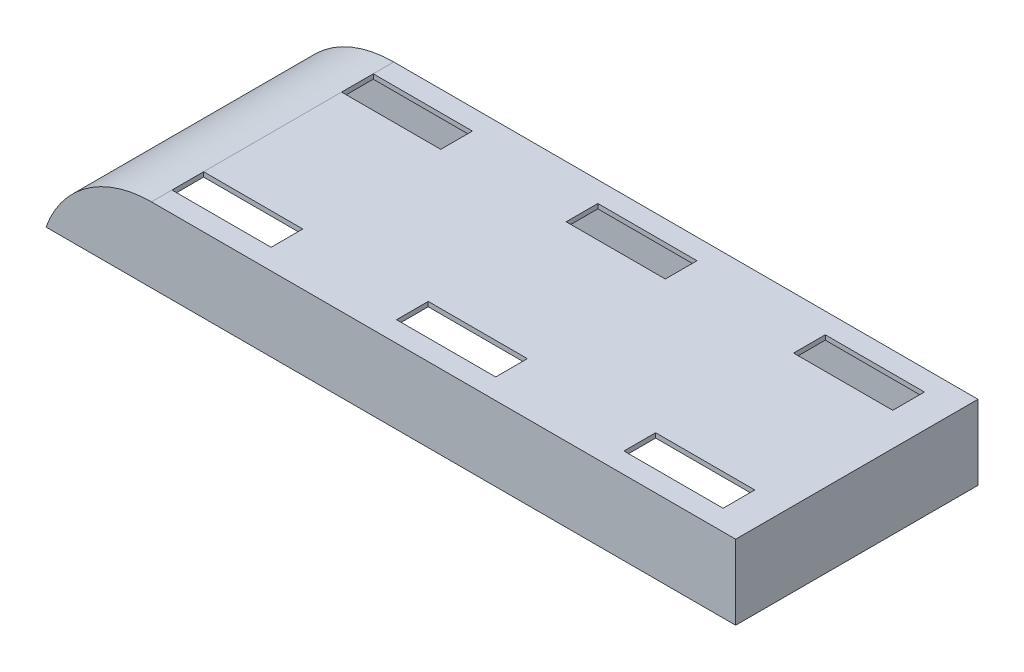
ISO-10303-21;
HEADER;
FILE_DESCRIPTION(('STEP AP214'),'2;1');
FILE_NAME('part.step','',(''),(''),'','','');
FILE_SCHEMA(('AUTOMOTIVE_DESIGN { 1 0 10303 214 1 1 1 1 }'));
ENDSEC;
DATA;
#1=APPLICATION_CONTEXT('core data for automotive mechanical design processes');
#2=APPLICATION_PROTOCOL_DEFINITION('international standard','automotive_design',2000,#1);
#3=PRODUCT_CONTEXT('',#1,'mechanical');
#4=PRODUCT('Part','Part','',(#3));
#5=PRODUCT_RELATED_PRODUCT_CATEGORY('part','',(#4));
#6=PRODUCT_DEFINITION_FORMATION('','',#4);
#7=PRODUCT_DEFINITION_CONTEXT('part definition',#1,'design');
#8=PRODUCT_DEFINITION('design','',#6,#7);
#9=PRODUCT_DEFINITION_SHAPE('','',#8);
#10=(LENGTH_UNIT() NAMED_UNIT(*) SI_UNIT(.MILLI.,.METRE.));
#11=(NAMED_UNIT(*) PLANE_ANGLE_UNIT() SI_UNIT($,.RADIAN.));
#12=(NAMED_UNIT(*) SI_UNIT($,.STERADIAN.) SOLID_ANGLE_UNIT());
#13=UNCERTAINTY_MEASURE_WITH_UNIT(LENGTH_MEASURE(1.E-05),#10,'distance_accuracy_value','');
#14=(GEOMETRIC_REPRESENTATION_CONTEXT(3) GLOBAL_UNCERTAINTY_ASSIGNED_CONTEXT((#13)) GLOBAL_UNIT_ASSIGNED_CONTEXT((#10,
#11,#12)) REPRESENTATION_CONTEXT('',''));
#15=CARTESIAN_POINT('',(0.,0.,0.));
#16=DIRECTION('',(0.,0.,1.));
#17=DIRECTION('',(1.,0.,0.));
#18=AXIS2_PLACEMENT_3D('',#15,#16,#17);
#19=CARTESIAN_POINT('',(0.,0.,0.));
#20=DIRECTION('',(0.,-1.,0.));
#21=DIRECTION('',(0.,0.,-1.));
#22=AXIS2_PLACEMENT_3D('',#19,#20,#21);
#23=PLANE('',#22);
#24=DIRECTION('',(0.,0.,1.));
#25=VECTOR('',#24,1.);
#26=CARTESIAN_POINT('',(0.,0.,0.));
#27=LINE('',#26,#25);
#28=CARTESIAN_POINT('',(0.,0.,-330.2));
#29=VERTEX_POINT('',#28);
#30=CARTESIAN_POINT('',(0.,0.,0.));
#31=VERTEX_POINT('',#30);
#32=EDGE_CURVE('E469',#29,#31,#27,.T.);
#33=ORIENTED_EDGE('',*,*,#32,.F.);
#34=DIRECTION('',(-1.,0.,0.));
#35=VECTOR('',#34,1.);
#36=CARTESIAN_POINT('',(0.,0.,-330.2));
#37=LINE('',#36,#35);
#38=CARTESIAN_POINT('',(939.8,0.,-330.2));
#39=VERTEX_POINT('',#38);
#40=EDGE_CURVE('E495',#39,#29,#37,.T.);
#41=ORIENTED_EDGE('',*,*,#40,.F.);
#42=DIRECTION('',(0.,0.,-1.));
#43=VECTOR('',#42,1.);
#44=CARTESIAN_POINT('',(939.8,0.,0.));
#45=LINE('',#44,#43);
#46=CARTESIAN_POINT('',(939.8,0.,0.));
#47=VERTEX_POINT('',#46);
#48=EDGE_CURVE('E508',#47,#39,#45,.T.);
#49=ORIENTED_EDGE('',*,*,#48,.F.);
#50=DIRECTION('',(1.,0.,0.));
#51=VECTOR('',#50,1.);
#52=CARTESIAN_POINT('',(0.,0.,0.));
#53=LINE('',#52,#51);
#54=EDGE_CURVE('E505',#31,#47,#53,.T.);
#55=ORIENTED_EDGE('',*,*,#54,.F.);
#56=EDGE_LOOP('',(#33,#41,#49,#55));
#57=FACE_BOUND('',#56,.T.);
#58=DIRECTION('',(-1.,0.,0.));
#59=VECTOR('',#58,1.);
#60=CARTESIAN_POINT('',(0.,0.,-323.85));
#61=LINE('',#60,#59);
#62=CARTESIAN_POINT('',(933.45,0.,-323.85));
#63=VERTEX_POINT('',#62);
#64=CARTESIAN_POINT('',(6.75359549152275,0.,-323.85));
#65=VERTEX_POINT('',#64);
#66=EDGE_CURVE('E450',#63,#65,#61,.T.);
#67=ORIENTED_EDGE('',*,*,#66,.T.);
#68=DIRECTION('',(0.,0.,-1.));
#69=VECTOR('',#68,1.);
#70=CARTESIAN_POINT('',(6.75359549152275,0.,-323.85));
#71=LINE('',#70,#69);
#72=CARTESIAN_POINT('',(6.75359549152275,0.,-6.35));
#73=VERTEX_POINT('',#72);
#74=EDGE_CURVE('E445',#65,#73,#71,.F.);
#75=ORIENTED_EDGE('',*,*,#74,.T.);
#76=DIRECTION('',(1.,0.,0.));
#77=VECTOR('',#76,1.);
#78=CARTESIAN_POINT('',(0.,0.,-6.35));
#79=LINE('',#78,#77);
#80=CARTESIAN_POINT('',(933.45,0.,-6.35));
#81=VERTEX_POINT('',#80);
#82=EDGE_CURVE('E477',#73,#81,#79,.T.);
#83=ORIENTED_EDGE('',*,*,#82,.T.);
#84=DIRECTION('',(0.,0.,-1.));
#85=VECTOR('',#84,1.);
#86=CARTESIAN_POINT('',(933.45,0.,0.));
#87=LINE('',#86,#85);
#88=EDGE_CURVE('E481',#81,#63,#87,.T.);
#89=ORIENTED_EDGE('',*,*,#88,.T.);
#90=EDGE_LOOP('',(#67,#75,#83,#89));
#91=FACE_BOUND('',#90,.T.);
#92=ADVANCED_FACE('F47',(#57,#91),#23,.T.);
#93=CARTESIAN_POINT('',(0.,101.6,0.));
#94=DIRECTION('',(0.,0.,-1.));
#95=DIRECTION('',(-1.,0.,0.));
#96=AXIS2_PLACEMENT_3D('',#93,#94,#95);
#97=PLANE('',#96);
#98=DIRECTION('',(1.,0.,0.));
#99=VECTOR('',#98,1.);
#100=CARTESIAN_POINT('',(0.,101.6,0.));
#101=LINE('',#100,#99);
#102=CARTESIAN_POINT('',(143.684097937106,101.6,0.));
#103=VERTEX_POINT('',#102);
#104=CARTESIAN_POINT('',(939.8,101.6,0.));
#105=VERTEX_POINT('',#104);
#106=EDGE_CURVE('E491',#103,#105,#101,.T.);
#107=ORIENTED_EDGE('',*,*,#106,.F.);
#108=CARTESIAN_POINT('',(143.684097937106,-50.7999999999999,0.));
#109=DIRECTION('',(0.,0.,-1.));
#110=DIRECTION('',(-1.,0.,0.));
#111=AXIS2_PLACEMENT_3D('',#108,#109,#110);
#112=CIRCLE('',#111,152.4);
#113=EDGE_CURVE('E523',#103,#31,#112,.F.);
#114=ORIENTED_EDGE('',*,*,#113,.T.);
#115=ORIENTED_EDGE('',*,*,#54,.T.);
#116=DIRECTION('',(0.,-1.,0.));
#117=VECTOR('',#116,1.);
#118=CARTESIAN_POINT('',(939.8,101.6,0.));
#119=LINE('',#118,#117);
#120=EDGE_CURVE('E516',#105,#47,#119,.T.);
#121=ORIENTED_EDGE('',*,*,#120,.F.);
#122=EDGE_LOOP('',(#107,#114,#115,#121));
#123=FACE_BOUND('',#122,.T.);
#124=ADVANCED_FACE('F643',(#123),#97,.F.);
#125=CARTESIAN_POINT('',(939.8,101.6,0.));
#126=DIRECTION('',(-1.,0.,0.));
#127=DIRECTION('',(0.,0.,1.));
#128=AXIS2_PLACEMENT_3D('',#125,#126,#127);
#129=PLANE('',#128);
#130=ORIENTED_EDGE('',*,*,#48,.T.);
#131=DIRECTION('',(0.,-1.,0.));
#132=VECTOR('',#131,1.);
#133=CARTESIAN_POINT('',(939.8,101.6,-330.2));
#134=LINE('',#133,#132);
#135=CARTESIAN_POINT('',(939.8,101.6,-330.2));
#136=VERTEX_POINT('',#135);
#137=EDGE_CURVE('E501',#136,#39,#134,.T.);
#138=ORIENTED_EDGE('',*,*,#137,.F.);
#139=DIRECTION('',(0.,0.,-1.));
#140=VECTOR('',#139,1.);
#141=CARTESIAN_POINT('',(939.8,101.6,0.));
#142=LINE('',#141,#140);
#143=EDGE_CURVE('E494',#105,#136,#142,.T.);
#144=ORIENTED_EDGE('',*,*,#143,.F.);
#145=ORIENTED_EDGE('',*,*,#120,.T.);
#146=EDGE_LOOP('',(#130,#138,#144,#145));
#147=FACE_BOUND('',#146,.T.);
#148=ADVANCED_FACE('F651',(#147),#129,.F.);
#149=CARTESIAN_POINT('',(0.,101.6,-330.2));
#150=DIRECTION('',(0.,0.,1.));
#151=DIRECTION('',(1.,0.,0.));
#152=AXIS2_PLACEMENT_3D('',#149,#150,#151);
#153=PLANE('',#152);
#154=ORIENTED_EDGE('',*,*,#40,.T.);
#155=CARTESIAN_POINT('',(143.684097937106,-50.7999999999999,-330.2));
#156=DIRECTION('',(0.,0.,1.));
#157=DIRECTION('',(1.,0.,0.));
#158=AXIS2_PLACEMENT_3D('',#155,#156,#157);
#159=CIRCLE('',#158,152.4);
#160=CARTESIAN_POINT('',(143.684097937106,101.6,-330.2));
#161=VERTEX_POINT('',#160);
#162=EDGE_CURVE('E527',#29,#161,#159,.F.);
#163=ORIENTED_EDGE('',*,*,#162,.T.);
#164=DIRECTION('',(-1.,0.,0.));
#165=VECTOR('',#164,1.);
#166=CARTESIAN_POINT('',(0.,101.6,-330.2));
#167=LINE('',#166,#165);
#168=EDGE_CURVE('E498',#136,#161,#167,.T.);
#169=ORIENTED_EDGE('',*,*,#168,.F.);
#170=ORIENTED_EDGE('',*,*,#137,.T.);
#171=EDGE_LOOP('',(#154,#163,#169,#170));
#172=FACE_BOUND('',#171,.T.);
#173=ADVANCED_FACE('F604',(#172),#153,.F.);
#174=CARTESIAN_POINT('',(0.,101.6,0.));
#175=DIRECTION('',(0.,-1.,0.));
#176=DIRECTION('',(0.,0.,-1.));
#177=AXIS2_PLACEMENT_3D('',#174,#175,#176);
#178=PLANE('',#177);
#179=DIRECTION('',(0.,0.,1.));
#180=VECTOR('',#179,1.);
#181=CARTESIAN_POINT('',(449.721069023888,101.6,-302.265));
#182=LINE('',#181,#180);
#183=CARTESIAN_POINT('',(449.721069023888,101.6,-302.265));
#184=VERTEX_POINT('',#183);
#185=CARTESIAN_POINT('',(449.721069023888,101.6,-259.085));
#186=VERTEX_POINT('',#185);
#187=EDGE_CURVE('E321',#184,#186,#182,.T.);
#188=ORIENTED_EDGE('',*,*,#187,.F.);
#189=DIRECTION('',(-1.,0.,0.));
#190=VECTOR('',#189,1.);
#191=CARTESIAN_POINT('',(449.721069023888,101.6,-302.265));
#192=LINE('',#191,#190);
#193=CARTESIAN_POINT('',(584.849069023888,101.6,-302.265));
#194=VERTEX_POINT('',#193);
#195=EDGE_CURVE('E63',#194,#184,#192,.T.);
#196=ORIENTED_EDGE('',*,*,#195,.F.);
#197=DIRECTION('',(0.,0.,-1.));
#198=VECTOR('',#197,1.);
#199=CARTESIAN_POINT('',(584.849069023888,101.6,-302.265));
#200=LINE('',#199,#198);
#201=CARTESIAN_POINT('',(584.849069023888,101.6,-259.085));
#202=VERTEX_POINT('',#201);
#203=EDGE_CURVE('E303',#202,#194,#200,.T.);
#204=ORIENTED_EDGE('',*,*,#203,.F.);
#205=DIRECTION('',(1.,0.,0.));
#206=VECTOR('',#205,1.);
#207=CARTESIAN_POINT('',(449.721069023888,101.6,-259.085));
#208=LINE('',#207,#206);
#209=EDGE_CURVE('E317',#186,#202,#208,.T.);
#210=ORIENTED_EDGE('',*,*,#209,.F.);
#211=EDGE_LOOP('',(#188,#196,#204,#210));
#212=FACE_BOUND('',#211,.T.);
#213=DIRECTION('',(-1.,0.,0.));
#214=VECTOR('',#213,1.);
#215=CARTESIAN_POINT('',(894.729069023888,101.6,-302.265));
#216=LINE('',#215,#214);
#217=CARTESIAN_POINT('',(894.729069023888,101.6,-302.265));
#218=VERTEX_POINT('',#217);
#219=CARTESIAN_POINT('',(759.601069023888,101.6,-302.265));
#220=VERTEX_POINT('',#219);
#221=EDGE_CURVE('E376',#218,#220,#216,.T.);
#222=ORIENTED_EDGE('',*,*,#221,.F.);
#223=DIRECTION('',(0.,0.,-1.));
#224=VECTOR('',#223,1.);
#225=CARTESIAN_POINT('',(894.729069023888,101.6,-302.265));
#226=LINE('',#225,#224);
#227=CARTESIAN_POINT('',(894.729069023888,101.6,-259.085));
#228=VERTEX_POINT('',#227);
#229=EDGE_CURVE('E71',#228,#218,#226,.T.);
#230=ORIENTED_EDGE('',*,*,#229,.F.);
#231=DIRECTION('',(1.,0.,0.));
#232=VECTOR('',#231,1.);
#233=CARTESIAN_POINT('',(894.729069023888,101.6,-259.085));
#234=LINE('',#233,#232);
#235=CARTESIAN_POINT('',(759.601069023888,101.6,-259.085));
#236=VERTEX_POINT('',#235);
#237=EDGE_CURVE('E358',#236,#228,#234,.T.);
#238=ORIENTED_EDGE('',*,*,#237,.F.);
#239=DIRECTION('',(0.,0.,1.));
#240=VECTOR('',#239,1.);
#241=CARTESIAN_POINT('',(759.601069023888,101.6,-302.265));
#242=LINE('',#241,#240);
#243=EDGE_CURVE('E372',#220,#236,#242,.T.);
#244=ORIENTED_EDGE('',*,*,#243,.F.);
#245=EDGE_LOOP('',(#222,#230,#238,#244));
#246=FACE_BOUND('',#245,.T.);
#247=DIRECTION('',(0.,0.,-1.));
#248=VECTOR('',#247,1.);
#249=CARTESIAN_POINT('',(894.729069023888,101.6,-27.9349999999999));
#250=LINE('',#249,#248);
#251=CARTESIAN_POINT('',(894.729069023888,101.6,-27.9349999999999));
#252=VERTEX_POINT('',#251);
#253=CARTESIAN_POINT('',(894.729069023888,101.6,-71.1150000000001));
#254=VERTEX_POINT('',#253);
#255=EDGE_CURVE('E399',#252,#254,#250,.T.);
#256=ORIENTED_EDGE('',*,*,#255,.F.);
#257=DIRECTION('',(1.,0.,0.));
#258=VECTOR('',#257,1.);
#259=CARTESIAN_POINT('',(894.729069023888,101.6,-27.9349999999999));
#260=LINE('',#259,#258);
#261=CARTESIAN_POINT('',(759.601069023888,101.6,-27.935));
#262=VERTEX_POINT('',#261);
#263=EDGE_CURVE('E368',#262,#252,#260,.T.);
#264=ORIENTED_EDGE('',*,*,#263,.F.);
#265=DIRECTION('',(0.,0.,1.));
#266=VECTOR('',#265,1.);
#267=CARTESIAN_POINT('',(759.601069023888,101.6,-27.935));
#268=LINE('',#267,#266);
#269=CARTESIAN_POINT('',(759.601069023888,101.6,-71.1150000000002));
#270=VERTEX_POINT('',#269);
#271=EDGE_CURVE('E386',#270,#262,#268,.T.);
#272=ORIENTED_EDGE('',*,*,#271,.F.);
#273=DIRECTION('',(-1.,0.,0.));
#274=VECTOR('',#273,1.);
#275=CARTESIAN_POINT('',(894.729069023888,101.6,-71.1150000000001));
#276=LINE('',#275,#274);
#277=EDGE_CURVE('E395',#254,#270,#276,.T.);
#278=ORIENTED_EDGE('',*,*,#277,.F.);
#279=EDGE_LOOP('',(#256,#264,#272,#278));
#280=FACE_BOUND('',#279,.T.);
#281=DIRECTION('',(1.,0.,0.));
#282=VECTOR('',#281,1.);
#283=CARTESIAN_POINT('',(449.721069023888,101.6,-27.9349999999999));
#284=LINE('',#283,#282);
#285=CARTESIAN_POINT('',(449.721069023888,101.6,-27.9349999999999));
#286=VERTEX_POINT('',#285);
#287=CARTESIAN_POINT('',(584.849069023888,101.6,-27.9349999999998));
#288=VERTEX_POINT('',#287);
#289=EDGE_CURVE('E407',#286,#288,#284,.T.);
#290=ORIENTED_EDGE('',*,*,#289,.F.);
#291=DIRECTION('',(0.,0.,1.));
#292=VECTOR('',#291,1.);
#293=CARTESIAN_POINT('',(449.721069023888,101.6,-27.9349999999999));
#294=LINE('',#293,#292);
#295=CARTESIAN_POINT('',(449.721069023888,101.6,-71.115));
#296=VERTEX_POINT('',#295);
#297=EDGE_CURVE('E327',#296,#286,#294,.T.);
#298=ORIENTED_EDGE('',*,*,#297,.F.);
#299=DIRECTION('',(-1.,0.,0.));
#300=VECTOR('',#299,1.);
#301=CARTESIAN_POINT('',(449.721069023888,101.6,-71.115));
#302=LINE('',#301,#300);
#303=CARTESIAN_POINT('',(584.849069023888,101.6,-71.1150000000001));
#304=VERTEX_POINT('',#303);
#305=EDGE_CURVE('E415',#304,#296,#302,.T.);
#306=ORIENTED_EDGE('',*,*,#305,.F.);
#307=DIRECTION('',(0.,0.,-1.));
#308=VECTOR('',#307,1.);
#309=CARTESIAN_POINT('',(584.849069023888,101.6,-27.9349999999998));
#310=LINE('',#309,#308);
#311=EDGE_CURVE('E411',#288,#304,#310,.T.);
#312=ORIENTED_EDGE('',*,*,#311,.F.);
#313=EDGE_LOOP('',(#290,#298,#306,#312));
#314=FACE_BOUND('',#313,.T.);
#315=DIRECTION('',(0.,0.,-1.));
#316=VECTOR('',#315,1.);
#317=CARTESIAN_POINT('',(143.684097937106,101.6,0.));
#318=LINE('',#317,#316);
#319=CARTESIAN_POINT('',(143.684097937106,101.6,-259.08));
#320=VERTEX_POINT('',#319);
#321=CARTESIAN_POINT('',(143.684097937106,101.6,-71.12));
#322=VERTEX_POINT('',#321);
#323=EDGE_CURVE('E524',#320,#322,#318,.F.);
#324=ORIENTED_EDGE('',*,*,#323,.T.);
#325=DIRECTION('',(-1.,0.,0.));
#326=VECTOR('',#325,1.);
#327=CARTESIAN_POINT('',(143.684097937106,101.6,-71.12));
#328=LINE('',#327,#326);
#329=CARTESIAN_POINT('',(278.812097937106,101.6,-71.12));
#330=VERTEX_POINT('',#329);
#331=EDGE_CURVE('E331',#330,#322,#328,.T.);
#332=ORIENTED_EDGE('',*,*,#331,.F.);
#333=DIRECTION('',(0.,0.,-1.));
#334=VECTOR('',#333,1.);
#335=CARTESIAN_POINT('',(278.812097937106,101.6,-27.9400000000001));
#336=LINE('',#335,#334);
#337=CARTESIAN_POINT('',(278.812097937106,101.6,-27.9400000000001));
#338=VERTEX_POINT('',#337);
#339=EDGE_CURVE('E344',#338,#330,#336,.T.);
#340=ORIENTED_EDGE('',*,*,#339,.F.);
#341=DIRECTION('',(1.,0.,0.));
#342=VECTOR('',#341,1.);
#343=CARTESIAN_POINT('',(143.684097937106,101.6,-27.9400000000001));
#344=LINE('',#343,#342);
#345=CARTESIAN_POINT('',(143.684097937106,101.6,-27.9400000000001));
#346=VERTEX_POINT('',#345);
#347=EDGE_CURVE('E348',#346,#338,#344,.T.);
#348=ORIENTED_EDGE('',*,*,#347,.F.);
#349=EDGE_CURVE('E520',#346,#103,#318,.F.);
#350=ORIENTED_EDGE('',*,*,#349,.T.);
#351=ORIENTED_EDGE('',*,*,#106,.T.);
#352=ORIENTED_EDGE('',*,*,#143,.T.);
#353=ORIENTED_EDGE('',*,*,#168,.T.);
#354=CARTESIAN_POINT('',(143.684097937106,101.6,-302.26));
#355=VERTEX_POINT('',#354);
#356=EDGE_CURVE('E287',#161,#355,#318,.F.);
#357=ORIENTED_EDGE('',*,*,#356,.T.);
#358=DIRECTION('',(-1.,0.,0.));
#359=VECTOR('',#358,1.);
#360=CARTESIAN_POINT('',(143.684097937106,101.6,-302.26));
#361=LINE('',#360,#359);
#362=CARTESIAN_POINT('',(278.812097937106,101.6,-302.26));
#363=VERTEX_POINT('',#362);
#364=EDGE_CURVE('E262',#363,#355,#361,.T.);
#365=ORIENTED_EDGE('',*,*,#364,.F.);
#366=DIRECTION('',(0.,0.,-1.));
#367=VECTOR('',#366,1.);
#368=CARTESIAN_POINT('',(278.812097937106,101.6,-302.26));
#369=LINE('',#368,#367);
#370=CARTESIAN_POINT('',(278.812097937106,101.6,-259.08));
#371=VERTEX_POINT('',#370);
#372=EDGE_CURVE('E272',#371,#363,#369,.T.);
#373=ORIENTED_EDGE('',*,*,#372,.F.);
#374=DIRECTION('',(1.,0.,0.));
#375=VECTOR('',#374,1.);
#376=CARTESIAN_POINT('',(143.684097937106,101.6,-259.08));
#377=LINE('',#376,#375);
#378=EDGE_CURVE('E279',#320,#371,#377,.T.);
#379=ORIENTED_EDGE('',*,*,#378,.F.);
#380=EDGE_LOOP('',(#324,#332,#340,#348,#350,#351,#352,#353,#357,#365,#373,#379));
#381=FACE_BOUND('',#380,.T.);
#382=ADVANCED_FACE('F284',(#212,#246,#280,#314,#381),#178,.F.);
#383=CARTESIAN_POINT('',(143.684097937106,-50.7999999999999,0.));
#384=DIRECTION('',(0.,0.,-1.));
#385=DIRECTION('',(-1.,0.,0.));
#386=AXIS2_PLACEMENT_3D('',#383,#384,#385);
#387=CYLINDRICAL_SURFACE('',#386,152.4);
#388=ORIENTED_EDGE('',*,*,#162,.F.);
#389=ORIENTED_EDGE('',*,*,#32,.T.);
#390=ORIENTED_EDGE('',*,*,#113,.F.);
#391=ORIENTED_EDGE('',*,*,#349,.F.);
#392=DIRECTION('',(0.,0.,1.));
#393=VECTOR('',#392,1.);
#394=CARTESIAN_POINT('',(143.684097937106,101.6,-27.9400000000001));
#395=LINE('',#394,#393);
#396=EDGE_CURVE('E313',#322,#346,#395,.T.);
#397=ORIENTED_EDGE('',*,*,#396,.F.);
#398=ORIENTED_EDGE('',*,*,#323,.F.);
#399=DIRECTION('',(0.,0.,1.));
#400=VECTOR('',#399,1.);
#401=CARTESIAN_POINT('',(143.684097937106,101.6,-302.26));
#402=LINE('',#401,#400);
#403=EDGE_CURVE('E290',#355,#320,#402,.T.);
#404=ORIENTED_EDGE('',*,*,#403,.F.);
#405=ORIENTED_EDGE('',*,*,#356,.F.);
#406=EDGE_LOOP('',(#388,#389,#390,#391,#397,#398,#404,#405));
#407=FACE_BOUND('',#406,.T.);
#408=ADVANCED_FACE('F49',(#407),#387,.T.);
#409=CARTESIAN_POINT('',(0.,101.6,-6.35));
#410=DIRECTION('',(0.,0.,-1.));
#411=DIRECTION('',(-1.,0.,0.));
#412=AXIS2_PLACEMENT_3D('',#409,#410,#411);
#413=PLANE('',#412);
#414=DIRECTION('',(1.,0.,0.));
#415=VECTOR('',#414,1.);
#416=CARTESIAN_POINT('',(0.,95.25,-6.35));
#417=LINE('',#416,#415);
#418=CARTESIAN_POINT('',(143.684097937106,95.25,-6.35));
#419=VERTEX_POINT('',#418);
#420=CARTESIAN_POINT('',(933.45,95.25,-6.35));
#421=VERTEX_POINT('',#420);
#422=EDGE_CURVE('E446',#419,#421,#417,.T.);
#423=ORIENTED_EDGE('',*,*,#422,.T.);
#424=DIRECTION('',(0.,-1.,0.));
#425=VECTOR('',#424,1.);
#426=CARTESIAN_POINT('',(933.45,101.6,-6.35));
#427=LINE('',#426,#425);
#428=EDGE_CURVE('E456',#421,#81,#427,.T.);
#429=ORIENTED_EDGE('',*,*,#428,.T.);
#430=ORIENTED_EDGE('',*,*,#82,.F.);
#431=CARTESIAN_POINT('',(143.684097937106,-50.7999999999999,-6.35));
#432=DIRECTION('',(0.,0.,-1.));
#433=DIRECTION('',(-1.,0.,0.));
#434=AXIS2_PLACEMENT_3D('',#431,#432,#433);
#435=CIRCLE('',#434,146.05);
#436=EDGE_CURVE('E451',#419,#73,#435,.F.);
#437=ORIENTED_EDGE('',*,*,#436,.F.);
#438=EDGE_LOOP('',(#423,#429,#430,#437));
#439=FACE_BOUND('',#438,.T.);
#440=ADVANCED_FACE('F718',(#439),#413,.T.);
#441=CARTESIAN_POINT('',(933.45,101.6,0.));
#442=DIRECTION('',(-1.,0.,0.));
#443=DIRECTION('',(0.,0.,1.));
#444=AXIS2_PLACEMENT_3D('',#441,#442,#443);
#445=PLANE('',#444);
#446=ORIENTED_EDGE('',*,*,#88,.F.);
#447=ORIENTED_EDGE('',*,*,#428,.F.);
#448=DIRECTION('',(0.,0.,-1.));
#449=VECTOR('',#448,1.);
#450=CARTESIAN_POINT('',(933.45,95.25,0.));
#451=LINE('',#450,#449);
#452=CARTESIAN_POINT('',(933.45,95.25,-323.85));
#453=VERTEX_POINT('',#452);
#454=EDGE_CURVE('E449',#421,#453,#451,.T.);
#455=ORIENTED_EDGE('',*,*,#454,.T.);
#456=DIRECTION('',(0.,-1.,0.));
#457=VECTOR('',#456,1.);
#458=CARTESIAN_POINT('',(933.45,101.6,-323.85));
#459=LINE('',#458,#457);
#460=EDGE_CURVE('E461',#453,#63,#459,.T.);
#461=ORIENTED_EDGE('',*,*,#460,.T.);
#462=EDGE_LOOP('',(#446,#447,#455,#461));
#463=FACE_BOUND('',#462,.T.);
#464=ADVANCED_FACE('F724',(#463),#445,.T.);
#465=CARTESIAN_POINT('',(0.,101.6,-323.85));
#466=DIRECTION('',(0.,0.,1.));
#467=DIRECTION('',(1.,0.,0.));
#468=AXIS2_PLACEMENT_3D('',#465,#466,#467);
#469=PLANE('',#468);
#470=ORIENTED_EDGE('',*,*,#66,.F.);
#471=ORIENTED_EDGE('',*,*,#460,.F.);
#472=DIRECTION('',(-1.,0.,0.));
#473=VECTOR('',#472,1.);
#474=CARTESIAN_POINT('',(0.,95.25,-323.85));
#475=LINE('',#474,#473);
#476=CARTESIAN_POINT('',(143.684097937106,95.25,-323.85));
#477=VERTEX_POINT('',#476);
#478=EDGE_CURVE('E464',#453,#477,#475,.T.);
#479=ORIENTED_EDGE('',*,*,#478,.T.);
#480=CARTESIAN_POINT('',(143.684097937106,-50.7999999999999,-323.85));
#481=DIRECTION('',(0.,0.,1.));
#482=DIRECTION('',(1.,0.,0.));
#483=AXIS2_PLACEMENT_3D('',#480,#481,#482);
#484=CIRCLE('',#483,146.05);
#485=EDGE_CURVE('E454',#65,#477,#484,.F.);
#486=ORIENTED_EDGE('',*,*,#485,.F.);
#487=EDGE_LOOP('',(#470,#471,#479,#486));
#488=FACE_BOUND('',#487,.T.);
#489=ADVANCED_FACE('F727',(#488),#469,.T.);
#490=CARTESIAN_POINT('',(0.,95.25,0.));
#491=DIRECTION('',(0.,-1.,0.));
#492=DIRECTION('',(0.,0.,-1.));
#493=AXIS2_PLACEMENT_3D('',#490,#491,#492);
#494=PLANE('',#493);
#495=DIRECTION('',(1.,0.,0.));
#496=VECTOR('',#495,1.);
#497=CARTESIAN_POINT('',(0.,95.25,-302.265));
#498=LINE('',#497,#496);
#499=CARTESIAN_POINT('',(449.721069023888,95.25,-302.265));
#500=VERTEX_POINT('',#499);
#501=CARTESIAN_POINT('',(584.849069023888,95.25,-302.265));
#502=VERTEX_POINT('',#501);
#503=EDGE_CURVE('E11',#500,#502,#498,.T.);
#504=ORIENTED_EDGE('',*,*,#503,.F.);
#505=DIRECTION('',(0.,0.,-1.));
#506=VECTOR('',#505,1.);
#507=CARTESIAN_POINT('',(449.721069023888,95.25,0.));
#508=LINE('',#507,#506);
#509=CARTESIAN_POINT('',(449.721069023888,95.25,-259.085));
#510=VERTEX_POINT('',#509);
#511=EDGE_CURVE('E575',#510,#500,#508,.T.);
#512=ORIENTED_EDGE('',*,*,#511,.F.);
#513=DIRECTION('',(-1.,0.,0.));
#514=VECTOR('',#513,1.);
#515=CARTESIAN_POINT('',(0.,95.25,-259.085));
#516=LINE('',#515,#514);
#517=CARTESIAN_POINT('',(584.849069023888,95.25,-259.085));
#518=VERTEX_POINT('',#517);
#519=EDGE_CURVE('E578',#518,#510,#516,.T.);
#520=ORIENTED_EDGE('',*,*,#519,.F.);
#521=DIRECTION('',(0.,0.,1.));
#522=VECTOR('',#521,1.);
#523=CARTESIAN_POINT('',(584.849069023888,95.25,0.));
#524=LINE('',#523,#522);
#525=EDGE_CURVE('E56',#502,#518,#524,.T.);
#526=ORIENTED_EDGE('',*,*,#525,.F.);
#527=EDGE_LOOP('',(#504,#512,#520,#526));
#528=FACE_BOUND('',#527,.T.);
#529=DIRECTION('',(1.,0.,0.));
#530=VECTOR('',#529,1.);
#531=CARTESIAN_POINT('',(0.,95.25,-71.12));
#532=LINE('',#531,#530);
#533=CARTESIAN_POINT('',(143.684097937106,95.25,-71.12));
#534=VERTEX_POINT('',#533);
#535=CARTESIAN_POINT('',(278.812097937106,95.25,-71.12));
#536=VERTEX_POINT('',#535);
#537=EDGE_CURVE('E442',#534,#536,#532,.T.);
#538=ORIENTED_EDGE('',*,*,#537,.F.);
#539=DIRECTION('',(0.,0.,-1.));
#540=VECTOR('',#539,1.);
#541=CARTESIAN_POINT('',(143.684097937106,95.25,0.));
#542=LINE('',#541,#540);
#543=CARTESIAN_POINT('',(143.684097937106,95.25,-259.08));
#544=VERTEX_POINT('',#543);
#545=EDGE_CURVE('E700',#544,#534,#542,.F.);
#546=ORIENTED_EDGE('',*,*,#545,.F.);
#547=DIRECTION('',(-1.,0.,0.));
#548=VECTOR('',#547,1.);
#549=CARTESIAN_POINT('',(0.,95.25,-259.08));
#550=LINE('',#549,#548);
#551=CARTESIAN_POINT('',(278.812097937106,95.25,-259.08));
#552=VERTEX_POINT('',#551);
#553=EDGE_CURVE('E423',#552,#544,#550,.T.);
#554=ORIENTED_EDGE('',*,*,#553,.F.);
#555=DIRECTION('',(0.,0.,1.));
#556=VECTOR('',#555,1.);
#557=CARTESIAN_POINT('',(278.812097937106,95.25,0.));
#558=LINE('',#557,#556);
#559=CARTESIAN_POINT('',(278.812097937106,95.25,-302.26));
#560=VERTEX_POINT('',#559);
#561=EDGE_CURVE('E543',#560,#552,#558,.T.);
#562=ORIENTED_EDGE('',*,*,#561,.F.);
#563=DIRECTION('',(1.,0.,0.));
#564=VECTOR('',#563,1.);
#565=CARTESIAN_POINT('',(0.,95.25,-302.26));
#566=LINE('',#565,#564);
#567=CARTESIAN_POINT('',(143.684097937106,95.25,-302.26));
#568=VERTEX_POINT('',#567);
#569=EDGE_CURVE('E265',#568,#560,#566,.T.);
#570=ORIENTED_EDGE('',*,*,#569,.F.);
#571=EDGE_CURVE('E455',#477,#568,#542,.F.);
#572=ORIENTED_EDGE('',*,*,#571,.F.);
#573=ORIENTED_EDGE('',*,*,#478,.F.);
#574=ORIENTED_EDGE('',*,*,#454,.F.);
#575=ORIENTED_EDGE('',*,*,#422,.F.);
#576=CARTESIAN_POINT('',(143.684097937106,95.25,-27.9400000000001));
#577=VERTEX_POINT('',#576);
#578=EDGE_CURVE('E460',#577,#419,#542,.F.);
#579=ORIENTED_EDGE('',*,*,#578,.F.);
#580=DIRECTION('',(-1.,0.,0.));
#581=VECTOR('',#580,1.);
#582=CARTESIAN_POINT('',(0.,95.25,-27.9400000000001));
#583=LINE('',#582,#581);
#584=CARTESIAN_POINT('',(278.812097937106,95.25,-27.9400000000001));
#585=VERTEX_POINT('',#584);
#586=EDGE_CURVE('E438',#585,#577,#583,.T.);
#587=ORIENTED_EDGE('',*,*,#586,.F.);
#588=DIRECTION('',(0.,0.,1.));
#589=VECTOR('',#588,1.);
#590=CARTESIAN_POINT('',(278.812097937106,95.25,0.));
#591=LINE('',#590,#589);
#592=EDGE_CURVE('E572',#536,#585,#591,.T.);
#593=ORIENTED_EDGE('',*,*,#592,.F.);
#594=EDGE_LOOP('',(#538,#546,#554,#562,#570,#572,#573,#574,#575,#579,#587,#593));
#595=FACE_BOUND('',#594,.T.);
#596=DIRECTION('',(0.,0.,1.));
#597=VECTOR('',#596,1.);
#598=CARTESIAN_POINT('',(894.729069023889,95.25,-2.30048358784564E-12));
#599=LINE('',#598,#597);
#600=CARTESIAN_POINT('',(894.729069023888,95.25,-302.265));
#601=VERTEX_POINT('',#600);
#602=CARTESIAN_POINT('',(894.729069023888,95.25,-259.085));
#603=VERTEX_POINT('',#602);
#604=EDGE_CURVE('E569',#601,#603,#599,.T.);
#605=ORIENTED_EDGE('',*,*,#604,.F.);
#606=DIRECTION('',(1.,0.,0.));
#607=VECTOR('',#606,1.);
#608=CARTESIAN_POINT('',(-2.48343468813512E-13,95.25,-302.264999999999));
#609=LINE('',#608,#607);
#610=CARTESIAN_POINT('',(759.601069023888,95.25,-302.265));
#611=VERTEX_POINT('',#610);
#612=EDGE_CURVE('E559',#611,#601,#609,.T.);
#613=ORIENTED_EDGE('',*,*,#612,.F.);
#614=DIRECTION('',(0.,0.,-1.));
#615=VECTOR('',#614,1.);
#616=CARTESIAN_POINT('',(759.601069023888,95.25,0.));
#617=LINE('',#616,#615);
#618=CARTESIAN_POINT('',(759.601069023888,95.25,-259.085));
#619=VERTEX_POINT('',#618);
#620=EDGE_CURVE('E562',#619,#611,#617,.T.);
#621=ORIENTED_EDGE('',*,*,#620,.F.);
#622=DIRECTION('',(-1.,0.,0.));
#623=VECTOR('',#622,1.);
#624=CARTESIAN_POINT('',(-1.06433208637369E-13,95.25,-259.085));
#625=LINE('',#624,#623);
#626=EDGE_CURVE('E566',#603,#619,#625,.T.);
#627=ORIENTED_EDGE('',*,*,#626,.F.);
#628=EDGE_LOOP('',(#605,#613,#621,#627));
#629=FACE_BOUND('',#628,.T.);
#630=DIRECTION('',(-1.,0.,0.));
#631=VECTOR('',#630,1.);
#632=CARTESIAN_POINT('',(0.,95.25,-27.9350000000006));
#633=LINE('',#632,#631);
#634=CARTESIAN_POINT('',(894.729069023888,95.25,-27.9349999999999));
#635=VERTEX_POINT('',#634);
#636=CARTESIAN_POINT('',(759.601069023888,95.25,-27.935));
#637=VERTEX_POINT('',#636);
#638=EDGE_CURVE('E556',#635,#637,#633,.T.);
#639=ORIENTED_EDGE('',*,*,#638,.F.);
#640=DIRECTION('',(0.,0.,1.));
#641=VECTOR('',#640,1.);
#642=CARTESIAN_POINT('',(894.729069023888,95.25,2.30048358784564E-12));
#643=LINE('',#642,#641);
#644=CARTESIAN_POINT('',(894.729069023888,95.25,-71.1150000000001));
#645=VERTEX_POINT('',#644);
#646=EDGE_CURVE('E546',#645,#635,#643,.T.);
#647=ORIENTED_EDGE('',*,*,#646,.F.);
#648=DIRECTION('',(1.,0.,0.));
#649=VECTOR('',#648,1.);
#650=CARTESIAN_POINT('',(0.,95.25,-71.1150000000004));
#651=LINE('',#650,#649);
#652=CARTESIAN_POINT('',(759.601069023888,95.25,-71.1150000000002));
#653=VERTEX_POINT('',#652);
#654=EDGE_CURVE('E549',#653,#645,#651,.T.);
#655=ORIENTED_EDGE('',*,*,#654,.F.);
#656=DIRECTION('',(0.,0.,-1.));
#657=VECTOR('',#656,1.);
#658=CARTESIAN_POINT('',(759.601069023888,95.25,0.));
#659=LINE('',#658,#657);
#660=EDGE_CURVE('E553',#637,#653,#659,.T.);
#661=ORIENTED_EDGE('',*,*,#660,.F.);
#662=EDGE_LOOP('',(#639,#647,#655,#661));
#663=FACE_BOUND('',#662,.T.);
#664=DIRECTION('',(0.,0.,-1.));
#665=VECTOR('',#664,1.);
#666=CARTESIAN_POINT('',(449.721069023888,95.25,5.78150400057155E-13));
#667=LINE('',#666,#665);
#668=CARTESIAN_POINT('',(449.721069023888,95.25,-27.9349999999999));
#669=VERTEX_POINT('',#668);
#670=CARTESIAN_POINT('',(449.721069023888,95.25,-71.115));
#671=VERTEX_POINT('',#670);
#672=EDGE_CURVE('E540',#669,#671,#667,.T.);
#673=ORIENTED_EDGE('',*,*,#672,.F.);
#674=DIRECTION('',(-1.,0.,0.));
#675=VECTOR('',#674,1.);
#676=CARTESIAN_POINT('',(0.,95.25,-27.9350000000003));
#677=LINE('',#676,#675);
#678=CARTESIAN_POINT('',(584.849069023888,95.25,-27.9349999999998));
#679=VERTEX_POINT('',#678);
#680=EDGE_CURVE('E530',#679,#669,#677,.T.);
#681=ORIENTED_EDGE('',*,*,#680,.F.);
#682=DIRECTION('',(0.,0.,1.));
#683=VECTOR('',#682,1.);
#684=CARTESIAN_POINT('',(584.849069023888,95.25,0.));
#685=LINE('',#684,#683);
#686=CARTESIAN_POINT('',(584.849069023888,95.25,-71.1150000000001));
#687=VERTEX_POINT('',#686);
#688=EDGE_CURVE('E533',#687,#679,#685,.T.);
#689=ORIENTED_EDGE('',*,*,#688,.F.);
#690=DIRECTION('',(1.,0.,0.));
#691=VECTOR('',#690,1.);
#692=CARTESIAN_POINT('',(0.,95.25,-71.1149999999997));
#693=LINE('',#692,#691);
#694=EDGE_CURVE('E537',#671,#687,#693,.T.);
#695=ORIENTED_EDGE('',*,*,#694,.F.);
#696=EDGE_LOOP('',(#673,#681,#689,#695));
#697=FACE_BOUND('',#696,.T.);
#698=ADVANCED_FACE('F595',(#528,#595,#629,#663,#697),#494,.T.);
#699=CARTESIAN_POINT('',(143.684097937106,-50.7999999999999,0.));
#700=DIRECTION('',(0.,0.,-1.));
#701=DIRECTION('',(-1.,0.,0.));
#702=AXIS2_PLACEMENT_3D('',#699,#700,#701);
#703=CYLINDRICAL_SURFACE('',#702,146.05);
#704=ORIENTED_EDGE('',*,*,#485,.T.);
#705=ORIENTED_EDGE('',*,*,#571,.T.);
#706=EDGE_CURVE('E476',#568,#544,#542,.F.);
#707=ORIENTED_EDGE('',*,*,#706,.T.);
#708=ORIENTED_EDGE('',*,*,#545,.T.);
#709=EDGE_CURVE('E706',#534,#577,#542,.F.);
#710=ORIENTED_EDGE('',*,*,#709,.T.);
#711=ORIENTED_EDGE('',*,*,#578,.T.);
#712=ORIENTED_EDGE('',*,*,#436,.T.);
#713=ORIENTED_EDGE('',*,*,#74,.F.);
#714=EDGE_LOOP('',(#704,#705,#707,#708,#710,#711,#712,#713));
#715=FACE_BOUND('',#714,.T.);
#716=ADVANCED_FACE('F707',(#715),#703,.F.);
#717=CARTESIAN_POINT('',(143.684097937106,-26.162,-302.26));
#718=DIRECTION('',(-1.,0.,0.));
#719=DIRECTION('',(0.,0.,1.));
#720=AXIS2_PLACEMENT_3D('',#717,#718,#719);
#721=PLANE('',#720);
#722=DIRECTION('',(0.,1.,0.));
#723=VECTOR('',#722,1.);
#724=CARTESIAN_POINT('',(143.684097937106,-26.162,-302.26));
#725=LINE('',#724,#723);
#726=EDGE_CURVE('E280',#568,#355,#725,.T.);
#727=ORIENTED_EDGE('',*,*,#726,.T.);
#728=ORIENTED_EDGE('',*,*,#403,.T.);
#729=DIRECTION('',(0.,1.,0.));
#730=VECTOR('',#729,1.);
#731=CARTESIAN_POINT('',(143.684097937106,-26.162,-259.08));
#732=LINE('',#731,#730);
#733=EDGE_CURVE('E685',#544,#320,#732,.T.);
#734=ORIENTED_EDGE('',*,*,#733,.F.);
#735=ORIENTED_EDGE('',*,*,#706,.F.);
#736=EDGE_LOOP('',(#727,#728,#734,#735));
#737=FACE_BOUND('',#736,.T.);
#738=ADVANCED_FACE('F684',(#737),#721,.F.);
#739=CARTESIAN_POINT('',(143.684097937106,-26.162,-302.26));
#740=DIRECTION('',(0.,0.,-1.));
#741=DIRECTION('',(-1.,0.,0.));
#742=AXIS2_PLACEMENT_3D('',#739,#740,#741);
#743=PLANE('',#742);
#744=ORIENTED_EDGE('',*,*,#569,.T.);
#745=DIRECTION('',(0.,1.,0.));
#746=VECTOR('',#745,1.);
#747=CARTESIAN_POINT('',(278.812097937106,-26.162,-302.26));
#748=LINE('',#747,#746);
#749=EDGE_CURVE('E257',#560,#363,#748,.T.);
#750=ORIENTED_EDGE('',*,*,#749,.T.);
#751=ORIENTED_EDGE('',*,*,#364,.T.);
#752=ORIENTED_EDGE('',*,*,#726,.F.);
#753=EDGE_LOOP('',(#744,#750,#751,#752));
#754=FACE_BOUND('',#753,.T.);
#755=ADVANCED_FACE('F259',(#754),#743,.F.);
#756=CARTESIAN_POINT('',(278.812097937106,-26.162,-302.26));
#757=DIRECTION('',(1.,0.,0.));
#758=DIRECTION('',(0.,0.,-1.));
#759=AXIS2_PLACEMENT_3D('',#756,#757,#758);
#760=PLANE('',#759);
#761=ORIENTED_EDGE('',*,*,#561,.T.);
#762=DIRECTION('',(0.,1.,0.));
#763=VECTOR('',#762,1.);
#764=CARTESIAN_POINT('',(278.812097937106,-26.162,-259.08));
#765=LINE('',#764,#763);
#766=EDGE_CURVE('E269',#552,#371,#765,.T.);
#767=ORIENTED_EDGE('',*,*,#766,.T.);
#768=ORIENTED_EDGE('',*,*,#372,.T.);
#769=ORIENTED_EDGE('',*,*,#749,.F.);
#770=EDGE_LOOP('',(#761,#767,#768,#769));
#771=FACE_BOUND('',#770,.T.);
#772=ADVANCED_FACE('F273',(#771),#760,.F.);
#773=CARTESIAN_POINT('',(143.684097937106,-26.162,-259.08));
#774=DIRECTION('',(0.,0.,1.));
#775=DIRECTION('',(1.,0.,0.));
#776=AXIS2_PLACEMENT_3D('',#773,#774,#775);
#777=PLANE('',#776);
#778=ORIENTED_EDGE('',*,*,#553,.T.);
#779=ORIENTED_EDGE('',*,*,#733,.T.);
#780=ORIENTED_EDGE('',*,*,#378,.T.);
#781=ORIENTED_EDGE('',*,*,#766,.F.);
#782=EDGE_LOOP('',(#778,#779,#780,#781));
#783=FACE_BOUND('',#782,.T.);
#784=ADVANCED_FACE('F695',(#783),#777,.F.);
#785=CARTESIAN_POINT('',(143.684097937106,-26.162,-27.9400000000001));
#786=DIRECTION('',(-1.,0.,0.));
#787=DIRECTION('',(0.,0.,1.));
#788=AXIS2_PLACEMENT_3D('',#785,#786,#787);
#789=PLANE('',#788);
#790=DIRECTION('',(0.,1.,0.));
#791=VECTOR('',#790,1.);
#792=CARTESIAN_POINT('',(143.684097937106,-26.162,-71.12));
#793=LINE('',#792,#791);
#794=EDGE_CURVE('E338',#534,#322,#793,.T.);
#795=ORIENTED_EDGE('',*,*,#794,.T.);
#796=ORIENTED_EDGE('',*,*,#396,.T.);
#797=DIRECTION('',(0.,1.,0.));
#798=VECTOR('',#797,1.);
#799=CARTESIAN_POINT('',(143.684097937106,-26.162,-27.9400000000001));
#800=LINE('',#799,#798);
#801=EDGE_CURVE('E328',#577,#346,#800,.T.);
#802=ORIENTED_EDGE('',*,*,#801,.F.);
#803=ORIENTED_EDGE('',*,*,#709,.F.);
#804=EDGE_LOOP('',(#795,#796,#802,#803));
#805=FACE_BOUND('',#804,.T.);
#806=ADVANCED_FACE('F750',(#805),#789,.F.);
#807=CARTESIAN_POINT('',(143.684097937106,-26.162,-71.12));
#808=DIRECTION('',(0.,0.,-1.));
#809=DIRECTION('',(-1.,0.,0.));
#810=AXIS2_PLACEMENT_3D('',#807,#808,#809);
#811=PLANE('',#810);
#812=ORIENTED_EDGE('',*,*,#537,.T.);
#813=DIRECTION('',(0.,1.,0.));
#814=VECTOR('',#813,1.);
#815=CARTESIAN_POINT('',(278.812097937106,-26.162,-71.12));
#816=LINE('',#815,#814);
#817=EDGE_CURVE('E335',#536,#330,#816,.T.);
#818=ORIENTED_EDGE('',*,*,#817,.T.);
#819=ORIENTED_EDGE('',*,*,#331,.T.);
#820=ORIENTED_EDGE('',*,*,#794,.F.);
#821=EDGE_LOOP('',(#812,#818,#819,#820));
#822=FACE_BOUND('',#821,.T.);
#823=ADVANCED_FACE('F764',(#822),#811,.F.);
#824=CARTESIAN_POINT('',(278.812097937106,-26.162,-27.9400000000001));
#825=DIRECTION('',(1.,0.,0.));
#826=DIRECTION('',(0.,0.,-1.));
#827=AXIS2_PLACEMENT_3D('',#824,#825,#826);
#828=PLANE('',#827);
#829=ORIENTED_EDGE('',*,*,#592,.T.);
#830=DIRECTION('',(0.,1.,0.));
#831=VECTOR('',#830,1.);
#832=CARTESIAN_POINT('',(278.812097937106,-26.162,-27.9400000000001));
#833=LINE('',#832,#831);
#834=EDGE_CURVE('E332',#585,#338,#833,.T.);
#835=ORIENTED_EDGE('',*,*,#834,.T.);
#836=ORIENTED_EDGE('',*,*,#339,.T.);
#837=ORIENTED_EDGE('',*,*,#817,.F.);
#838=EDGE_LOOP('',(#829,#835,#836,#837));
#839=FACE_BOUND('',#838,.T.);
#840=ADVANCED_FACE('F769',(#839),#828,.F.);
#841=CARTESIAN_POINT('',(143.684097937106,-26.162,-27.9400000000001));
#842=DIRECTION('',(0.,0.,1.));
#843=DIRECTION('',(1.,0.,0.));
#844=AXIS2_PLACEMENT_3D('',#841,#842,#843);
#845=PLANE('',#844);
#846=ORIENTED_EDGE('',*,*,#586,.T.);
#847=ORIENTED_EDGE('',*,*,#801,.T.);
#848=ORIENTED_EDGE('',*,*,#347,.T.);
#849=ORIENTED_EDGE('',*,*,#834,.F.);
#850=EDGE_LOOP('',(#846,#847,#848,#849));
#851=FACE_BOUND('',#850,.T.);
#852=ADVANCED_FACE('F766',(#851),#845,.F.);
#853=CARTESIAN_POINT('',(449.721069023888,-26.162,-27.9349999999999));
#854=DIRECTION('',(-1.,0.,0.));
#855=DIRECTION('',(0.,0.,1.));
#856=AXIS2_PLACEMENT_3D('',#853,#854,#855);
#857=PLANE('',#856);
#858=ORIENTED_EDGE('',*,*,#672,.T.);
#859=DIRECTION('',(0.,1.,0.));
#860=VECTOR('',#859,1.);
#861=CARTESIAN_POINT('',(449.721069023888,-26.162,-71.115));
#862=LINE('',#861,#860);
#863=EDGE_CURVE('E420',#671,#296,#862,.T.);
#864=ORIENTED_EDGE('',*,*,#863,.T.);
#865=ORIENTED_EDGE('',*,*,#297,.T.);
#866=DIRECTION('',(0.,1.,0.));
#867=VECTOR('',#866,1.);
#868=CARTESIAN_POINT('',(449.721069023888,-26.162,-27.9349999999999));
#869=LINE('',#868,#867);
#870=EDGE_CURVE('E419',#669,#286,#869,.T.);
#871=ORIENTED_EDGE('',*,*,#870,.F.);
#872=EDGE_LOOP('',(#858,#864,#865,#871));
#873=FACE_BOUND('',#872,.T.);
#874=ADVANCED_FACE('F623',(#873),#857,.F.);
#875=CARTESIAN_POINT('',(449.721069023888,-26.162,-71.115));
#876=DIRECTION('',(0.,0.,-1.));
#877=DIRECTION('',(-1.,0.,0.));
#878=AXIS2_PLACEMENT_3D('',#875,#876,#877);
#879=PLANE('',#878);
#880=ORIENTED_EDGE('',*,*,#694,.T.);
#881=DIRECTION('',(0.,1.,0.));
#882=VECTOR('',#881,1.);
#883=CARTESIAN_POINT('',(584.849069023888,-26.162,-71.1150000000001));
#884=LINE('',#883,#882);
#885=EDGE_CURVE('E424',#687,#304,#884,.T.);
#886=ORIENTED_EDGE('',*,*,#885,.T.);
#887=ORIENTED_EDGE('',*,*,#305,.T.);
#888=ORIENTED_EDGE('',*,*,#863,.F.);
#889=EDGE_LOOP('',(#880,#886,#887,#888));
#890=FACE_BOUND('',#889,.T.);
#891=ADVANCED_FACE('F630',(#890),#879,.F.);
#892=CARTESIAN_POINT('',(584.849069023888,-26.162,-27.9349999999998));
#893=DIRECTION('',(1.,0.,0.));
#894=DIRECTION('',(0.,0.,-1.));
#895=AXIS2_PLACEMENT_3D('',#892,#893,#894);
#896=PLANE('',#895);
#897=ORIENTED_EDGE('',*,*,#688,.T.);
#898=DIRECTION('',(0.,1.,0.));
#899=VECTOR('',#898,1.);
#900=CARTESIAN_POINT('',(584.849069023888,-26.162,-27.9349999999998));
#901=LINE('',#900,#899);
#902=EDGE_CURVE('E427',#679,#288,#901,.T.);
#903=ORIENTED_EDGE('',*,*,#902,.T.);
#904=ORIENTED_EDGE('',*,*,#311,.T.);
#905=ORIENTED_EDGE('',*,*,#885,.F.);
#906=EDGE_LOOP('',(#897,#903,#904,#905));
#907=FACE_BOUND('',#906,.T.);
#908=ADVANCED_FACE('F632',(#907),#896,.F.);
#909=CARTESIAN_POINT('',(449.721069023888,-26.162,-27.9349999999999));
#910=DIRECTION('',(0.,0.,1.));
#911=DIRECTION('',(1.,0.,0.));
#912=AXIS2_PLACEMENT_3D('',#909,#910,#911);
#913=PLANE('',#912);
#914=ORIENTED_EDGE('',*,*,#680,.T.);
#915=ORIENTED_EDGE('',*,*,#870,.T.);
#916=ORIENTED_EDGE('',*,*,#289,.T.);
#917=ORIENTED_EDGE('',*,*,#902,.F.);
#918=EDGE_LOOP('',(#914,#915,#916,#917));
#919=FACE_BOUND('',#918,.T.);
#920=ADVANCED_FACE('F618',(#919),#913,.F.);
#921=CARTESIAN_POINT('',(894.729069023888,-26.162,-27.9349999999999));
#922=DIRECTION('',(0.,0.,1.));
#923=DIRECTION('',(1.,0.,0.));
#924=AXIS2_PLACEMENT_3D('',#921,#922,#923);
#925=PLANE('',#924);
#926=ORIENTED_EDGE('',*,*,#638,.T.);
#927=DIRECTION('',(0.,1.,0.));
#928=VECTOR('',#927,1.);
#929=CARTESIAN_POINT('',(759.601069023888,-26.162,-27.935));
#930=LINE('',#929,#928);
#931=EDGE_CURVE('E289',#637,#262,#930,.T.);
#932=ORIENTED_EDGE('',*,*,#931,.T.);
#933=ORIENTED_EDGE('',*,*,#263,.T.);
#934=DIRECTION('',(0.,1.,0.));
#935=VECTOR('',#934,1.);
#936=CARTESIAN_POINT('',(894.729069023888,-26.162,-27.9349999999999));
#937=LINE('',#936,#935);
#938=EDGE_CURVE('E382',#635,#252,#937,.T.);
#939=ORIENTED_EDGE('',*,*,#938,.F.);
#940=EDGE_LOOP('',(#926,#932,#933,#939));
#941=FACE_BOUND('',#940,.T.);
#942=ADVANCED_FACE('F639',(#941),#925,.F.);
#943=CARTESIAN_POINT('',(759.601069023888,-26.162,-27.935));
#944=DIRECTION('',(-1.,0.,0.));
#945=DIRECTION('',(0.,0.,1.));
#946=AXIS2_PLACEMENT_3D('',#943,#944,#945);
#947=PLANE('',#946);
#948=ORIENTED_EDGE('',*,*,#660,.T.);
#949=DIRECTION('',(0.,1.,0.));
#950=VECTOR('',#949,1.);
#951=CARTESIAN_POINT('',(759.601069023888,-26.162,-71.1150000000002));
#952=LINE('',#951,#950);
#953=EDGE_CURVE('E294',#653,#270,#952,.T.);
#954=ORIENTED_EDGE('',*,*,#953,.T.);
#955=ORIENTED_EDGE('',*,*,#271,.T.);
#956=ORIENTED_EDGE('',*,*,#931,.F.);
#957=EDGE_LOOP('',(#948,#954,#955,#956));
#958=FACE_BOUND('',#957,.T.);
#959=ADVANCED_FACE('F794',(#958),#947,.F.);
#960=CARTESIAN_POINT('',(894.729069023888,-26.162,-71.1150000000001));
#961=DIRECTION('',(0.,0.,-1.));
#962=DIRECTION('',(-1.,0.,0.));
#963=AXIS2_PLACEMENT_3D('',#960,#961,#962);
#964=PLANE('',#963);
#965=ORIENTED_EDGE('',*,*,#654,.T.);
#966=DIRECTION('',(0.,1.,0.));
#967=VECTOR('',#966,1.);
#968=CARTESIAN_POINT('',(894.729069023888,-26.162,-71.1150000000001));
#969=LINE('',#968,#967);
#970=EDGE_CURVE('E387',#645,#254,#969,.T.);
#971=ORIENTED_EDGE('',*,*,#970,.T.);
#972=ORIENTED_EDGE('',*,*,#277,.T.);
#973=ORIENTED_EDGE('',*,*,#953,.F.);
#974=EDGE_LOOP('',(#965,#971,#972,#973));
#975=FACE_BOUND('',#974,.T.);
#976=ADVANCED_FACE('F798',(#975),#964,.F.);
#977=CARTESIAN_POINT('',(894.729069023888,-26.162,-27.9349999999999));
#978=DIRECTION('',(1.,0.,0.));
#979=DIRECTION('',(0.,0.,-1.));
#980=AXIS2_PLACEMENT_3D('',#977,#978,#979);
#981=PLANE('',#980);
#982=ORIENTED_EDGE('',*,*,#646,.T.);
#983=ORIENTED_EDGE('',*,*,#938,.T.);
#984=ORIENTED_EDGE('',*,*,#255,.T.);
#985=ORIENTED_EDGE('',*,*,#970,.F.);
#986=EDGE_LOOP('',(#982,#983,#984,#985));
#987=FACE_BOUND('',#986,.T.);
#988=ADVANCED_FACE('F781',(#987),#981,.F.);
#989=CARTESIAN_POINT('',(894.729069023888,-26.162,-302.265));
#990=DIRECTION('',(1.,0.,0.));
#991=DIRECTION('',(0.,0.,-1.));
#992=AXIS2_PLACEMENT_3D('',#989,#990,#991);
#993=PLANE('',#992);
#994=ORIENTED_EDGE('',*,*,#604,.T.);
#995=DIRECTION('',(0.,1.,0.));
#996=VECTOR('',#995,1.);
#997=CARTESIAN_POINT('',(894.729069023888,-26.162,-259.085));
#998=LINE('',#997,#996);
#999=EDGE_CURVE('E365',#603,#228,#998,.T.);
#1000=ORIENTED_EDGE('',*,*,#999,.T.);
#1001=ORIENTED_EDGE('',*,*,#229,.T.);
#1002=DIRECTION('',(0.,1.,0.));
#1003=VECTOR('',#1002,1.);
#1004=CARTESIAN_POINT('',(894.729069023888,-26.162,-302.265));
#1005=LINE('',#1004,#1003);
#1006=EDGE_CURVE('E355',#601,#218,#1005,.T.);
#1007=ORIENTED_EDGE('',*,*,#1006,.F.);
#1008=EDGE_LOOP('',(#994,#1000,#1001,#1007));
#1009=FACE_BOUND('',#1008,.T.);
#1010=ADVANCED_FACE('F777',(#1009),#993,.F.);
#1011=CARTESIAN_POINT('',(894.729069023888,-26.162,-259.085));
#1012=DIRECTION('',(0.,0.,1.));
#1013=DIRECTION('',(1.,0.,0.));
#1014=AXIS2_PLACEMENT_3D('',#1011,#1012,#1013);
#1015=PLANE('',#1014);
#1016=ORIENTED_EDGE('',*,*,#626,.T.);
#1017=DIRECTION('',(0.,1.,0.));
#1018=VECTOR('',#1017,1.);
#1019=CARTESIAN_POINT('',(759.601069023888,-26.162,-259.085));
#1020=LINE('',#1019,#1018);
#1021=EDGE_CURVE('E362',#619,#236,#1020,.T.);
#1022=ORIENTED_EDGE('',*,*,#1021,.T.);
#1023=ORIENTED_EDGE('',*,*,#237,.T.);
#1024=ORIENTED_EDGE('',*,*,#999,.F.);
#1025=EDGE_LOOP('',(#1016,#1022,#1023,#1024));
#1026=FACE_BOUND('',#1025,.T.);
#1027=ADVANCED_FACE('F780',(#1026),#1015,.F.);
#1028=CARTESIAN_POINT('',(759.601069023888,-26.162,-302.265));
#1029=DIRECTION('',(-1.,0.,0.));
#1030=DIRECTION('',(0.,0.,1.));
#1031=AXIS2_PLACEMENT_3D('',#1028,#1029,#1030);
#1032=PLANE('',#1031);
#1033=ORIENTED_EDGE('',*,*,#620,.T.);
#1034=DIRECTION('',(0.,1.,0.));
#1035=VECTOR('',#1034,1.);
#1036=CARTESIAN_POINT('',(759.601069023888,-26.162,-302.265));
#1037=LINE('',#1036,#1035);
#1038=EDGE_CURVE('E359',#611,#220,#1037,.T.);
#1039=ORIENTED_EDGE('',*,*,#1038,.T.);
#1040=ORIENTED_EDGE('',*,*,#243,.T.);
#1041=ORIENTED_EDGE('',*,*,#1021,.F.);
#1042=EDGE_LOOP('',(#1033,#1039,#1040,#1041));
#1043=FACE_BOUND('',#1042,.T.);
#1044=ADVANCED_FACE('F784',(#1043),#1032,.F.);
#1045=CARTESIAN_POINT('',(894.729069023888,-26.162,-302.265));
#1046=DIRECTION('',(0.,0.,-1.));
#1047=DIRECTION('',(-1.,0.,0.));
#1048=AXIS2_PLACEMENT_3D('',#1045,#1046,#1047);
#1049=PLANE('',#1048);
#1050=ORIENTED_EDGE('',*,*,#612,.T.);
#1051=ORIENTED_EDGE('',*,*,#1006,.T.);
#1052=ORIENTED_EDGE('',*,*,#221,.T.);
#1053=ORIENTED_EDGE('',*,*,#1038,.F.);
#1054=EDGE_LOOP('',(#1050,#1051,#1052,#1053));
#1055=FACE_BOUND('',#1054,.T.);
#1056=ADVANCED_FACE('F755',(#1055),#1049,.F.);
#1057=CARTESIAN_POINT('',(449.721069023888,-26.162,-302.265));
#1058=DIRECTION('',(0.,0.,-1.));
#1059=DIRECTION('',(-1.,0.,0.));
#1060=AXIS2_PLACEMENT_3D('',#1057,#1058,#1059);
#1061=PLANE('',#1060);
#1062=ORIENTED_EDGE('',*,*,#503,.T.);
#1063=DIRECTION('',(0.,1.,0.));
#1064=VECTOR('',#1063,1.);
#1065=CARTESIAN_POINT('',(584.849069023888,-26.162,-302.265));
#1066=LINE('',#1065,#1064);
#1067=EDGE_CURVE('E310',#502,#194,#1066,.T.);
#1068=ORIENTED_EDGE('',*,*,#1067,.T.);
#1069=ORIENTED_EDGE('',*,*,#195,.T.);
#1070=DIRECTION('',(0.,1.,0.));
#1071=VECTOR('',#1070,1.);
#1072=CARTESIAN_POINT('',(449.721069023888,-26.162,-302.265));
#1073=LINE('',#1072,#1071);
#1074=EDGE_CURVE('E300',#500,#184,#1073,.T.);
#1075=ORIENTED_EDGE('',*,*,#1074,.F.);
#1076=EDGE_LOOP('',(#1062,#1068,#1069,#1075));
#1077=FACE_BOUND('',#1076,.T.);
#1078=ADVANCED_FACE('F600',(#1077),#1061,.F.);
#1079=CARTESIAN_POINT('',(584.849069023888,-26.162,-302.265));
#1080=DIRECTION('',(1.,0.,0.));
#1081=DIRECTION('',(0.,0.,-1.));
#1082=AXIS2_PLACEMENT_3D('',#1079,#1080,#1081);
#1083=PLANE('',#1082);
#1084=ORIENTED_EDGE('',*,*,#525,.T.);
#1085=DIRECTION('',(0.,1.,0.));
#1086=VECTOR('',#1085,1.);
#1087=CARTESIAN_POINT('',(584.849069023888,-26.162,-259.085));
#1088=LINE('',#1087,#1086);
#1089=EDGE_CURVE('E307',#518,#202,#1088,.T.);
#1090=ORIENTED_EDGE('',*,*,#1089,.T.);
#1091=ORIENTED_EDGE('',*,*,#203,.T.);
#1092=ORIENTED_EDGE('',*,*,#1067,.F.);
#1093=EDGE_LOOP('',(#1084,#1090,#1091,#1092));
#1094=FACE_BOUND('',#1093,.T.);
#1095=ADVANCED_FACE('F586',(#1094),#1083,.F.);
#1096=CARTESIAN_POINT('',(449.721069023888,-26.162,-259.085));
#1097=DIRECTION('',(0.,0.,1.));
#1098=DIRECTION('',(1.,0.,0.));
#1099=AXIS2_PLACEMENT_3D('',#1096,#1097,#1098);
#1100=PLANE('',#1099);
#1101=ORIENTED_EDGE('',*,*,#519,.T.);
#1102=DIRECTION('',(0.,1.,0.));
#1103=VECTOR('',#1102,1.);
#1104=CARTESIAN_POINT('',(449.721069023888,-26.162,-259.085));
#1105=LINE('',#1104,#1103);
#1106=EDGE_CURVE('E304',#510,#186,#1105,.T.);
#1107=ORIENTED_EDGE('',*,*,#1106,.T.);
#1108=ORIENTED_EDGE('',*,*,#209,.T.);
#1109=ORIENTED_EDGE('',*,*,#1089,.F.);
#1110=EDGE_LOOP('',(#1101,#1107,#1108,#1109));
#1111=FACE_BOUND('',#1110,.T.);
#1112=ADVANCED_FACE('F591',(#1111),#1100,.F.);
#1113=CARTESIAN_POINT('',(449.721069023888,-26.162,-302.265));
#1114=DIRECTION('',(-1.,0.,0.));
#1115=DIRECTION('',(0.,0.,1.));
#1116=AXIS2_PLACEMENT_3D('',#1113,#1114,#1115);
#1117=PLANE('',#1116);
#1118=ORIENTED_EDGE('',*,*,#511,.T.);
#1119=ORIENTED_EDGE('',*,*,#1074,.T.);
#1120=ORIENTED_EDGE('',*,*,#187,.T.);
#1121=ORIENTED_EDGE('',*,*,#1106,.F.);
#1122=EDGE_LOOP('',(#1118,#1119,#1120,#1121));
#1123=FACE_BOUND('',#1122,.T.);
#1124=ADVANCED_FACE('F598',(#1123),#1117,.F.);
#1125=CLOSED_SHELL('',(#92,#124,#148,#173,#382,#408,#440,#464,#489,#698,#716,#738,#755,#772,
#784,#806,#823,#840,#852,#874,#891,#908,#920,#942,#959,#976,#988,#1010,#1027,#1044,#1056,#1078,
#1095,#1112,#1124));
#1126=MANIFOLD_SOLID_BREP('B2',#1125);
#1127=ADVANCED_BREP_SHAPE_REPRESENTATION('',(#18,#1126),#14);
#1128=SHAPE_DEFINITION_REPRESENTATION(#9,#1127);
ENDSEC;
END-ISO-10303-21;
